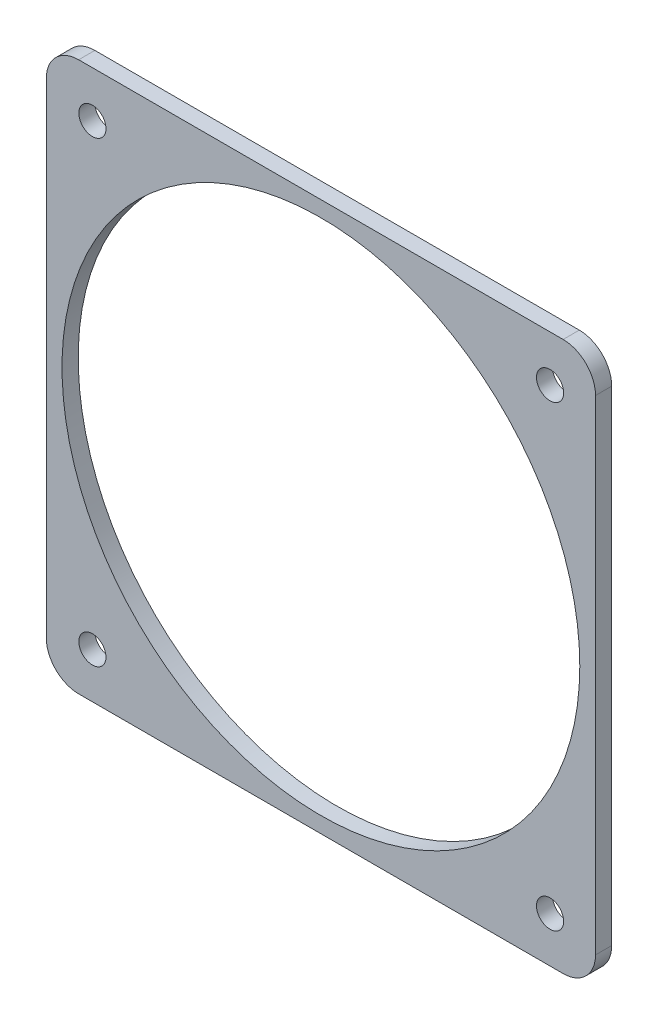
ISO-10303-21;
HEADER;
FILE_DESCRIPTION(('STEP AP214'),'2;1');
FILE_NAME('part.step','',(''),(''),'','','');
FILE_SCHEMA(('AUTOMOTIVE_DESIGN { 1 0 10303 214 1 1 1 1 }'));
ENDSEC;
DATA;
#1=APPLICATION_CONTEXT('core data for automotive mechanical design processes');
#2=APPLICATION_PROTOCOL_DEFINITION('international standard','automotive_design',2000,#1);
#3=PRODUCT_CONTEXT('',#1,'mechanical');
#4=PRODUCT('Part','Part','',(#3));
#5=PRODUCT_RELATED_PRODUCT_CATEGORY('part','',(#4));
#6=PRODUCT_DEFINITION_FORMATION('','',#4);
#7=PRODUCT_DEFINITION_CONTEXT('part definition',#1,'design');
#8=PRODUCT_DEFINITION('design','',#6,#7);
#9=PRODUCT_DEFINITION_SHAPE('','',#8);
#10=(LENGTH_UNIT() NAMED_UNIT(*) SI_UNIT(.MILLI.,.METRE.));
#11=(NAMED_UNIT(*) PLANE_ANGLE_UNIT() SI_UNIT($,.RADIAN.));
#12=(NAMED_UNIT(*) SI_UNIT($,.STERADIAN.) SOLID_ANGLE_UNIT());
#13=UNCERTAINTY_MEASURE_WITH_UNIT(LENGTH_MEASURE(1.E-05),#10,'distance_accuracy_value','');
#14=(GEOMETRIC_REPRESENTATION_CONTEXT(3) GLOBAL_UNCERTAINTY_ASSIGNED_CONTEXT((#13)) GLOBAL_UNIT_ASSIGNED_CONTEXT((#10,
#11,#12)) REPRESENTATION_CONTEXT('',''));
#15=CARTESIAN_POINT('',(0.,0.,0.));
#16=DIRECTION('',(0.,0.,1.));
#17=DIRECTION('',(1.,0.,0.));
#18=AXIS2_PLACEMENT_3D('',#15,#16,#17);
#19=CARTESIAN_POINT('',(-53.8815367264149,-53.8815367264149,3.175));
#20=DIRECTION('',(0.,1.,0.));
#21=DIRECTION('',(0.,0.,1.));
#22=AXIS2_PLACEMENT_3D('',#19,#20,#21);
#23=PLANE('',#22);
#24=DIRECTION('',(1.,0.,0.));
#25=VECTOR('',#24,1.);
#26=CARTESIAN_POINT('',(-53.8815367264149,-53.8815367264149,3.175));
#27=LINE('',#26,#25);
#28=CARTESIAN_POINT('',(-47.5315367264149,-53.8815367264149,3.175));
#29=VERTEX_POINT('',#28);
#30=CARTESIAN_POINT('',(47.5315367264149,-53.8815367264149,3.175));
#31=VERTEX_POINT('',#30);
#32=EDGE_CURVE('E174',#29,#31,#27,.T.);
#33=ORIENTED_EDGE('',*,*,#32,.F.);
#34=DIRECTION('',(0.,0.,-1.));
#35=VECTOR('',#34,1.);
#36=CARTESIAN_POINT('',(-47.5315367264149,-53.8815367264149,0.));
#37=LINE('',#36,#35);
#38=CARTESIAN_POINT('',(-47.5315367264149,-53.8815367264149,0.));
#39=VERTEX_POINT('',#38);
#40=EDGE_CURVE('E11',#29,#39,#37,.T.);
#41=ORIENTED_EDGE('',*,*,#40,.T.);
#42=DIRECTION('',(1.,0.,0.));
#43=VECTOR('',#42,1.);
#44=CARTESIAN_POINT('',(-53.8815367264149,-53.8815367264149,0.));
#45=LINE('',#44,#43);
#46=CARTESIAN_POINT('',(47.5315367264149,-53.8815367264149,0.));
#47=VERTEX_POINT('',#46);
#48=EDGE_CURVE('E177',#39,#47,#45,.T.);
#49=ORIENTED_EDGE('',*,*,#48,.T.);
#50=DIRECTION('',(0.,0.,-1.));
#51=VECTOR('',#50,1.);
#52=CARTESIAN_POINT('',(47.5315367264149,-53.8815367264149,3.175));
#53=LINE('',#52,#51);
#54=EDGE_CURVE('E50',#47,#31,#53,.F.);
#55=ORIENTED_EDGE('',*,*,#54,.T.);
#56=EDGE_LOOP('',(#33,#41,#49,#55));
#57=FACE_BOUND('',#56,.T.);
#58=ADVANCED_FACE('F41',(#57),#23,.F.);
#59=CARTESIAN_POINT('',(53.8815367264149,-53.8815367264149,3.175));
#60=DIRECTION('',(-1.,0.,0.));
#61=DIRECTION('',(0.,0.,1.));
#62=AXIS2_PLACEMENT_3D('',#59,#60,#61);
#63=PLANE('',#62);
#64=DIRECTION('',(0.,1.,0.));
#65=VECTOR('',#64,1.);
#66=CARTESIAN_POINT('',(53.8815367264149,-53.8815367264149,0.));
#67=LINE('',#66,#65);
#68=CARTESIAN_POINT('',(53.8815367264149,-47.5315367264149,0.));
#69=VERTEX_POINT('',#68);
#70=CARTESIAN_POINT('',(53.8815367264149,47.5315367264149,0.));
#71=VERTEX_POINT('',#70);
#72=EDGE_CURVE('E134',#69,#71,#67,.T.);
#73=ORIENTED_EDGE('',*,*,#72,.T.);
#74=DIRECTION('',(0.,0.,-1.));
#75=VECTOR('',#74,1.);
#76=CARTESIAN_POINT('',(53.8815367264149,47.5315367264149,3.175));
#77=LINE('',#76,#75);
#78=CARTESIAN_POINT('',(53.8815367264149,47.5315367264149,3.175));
#79=VERTEX_POINT('',#78);
#80=EDGE_CURVE('E154',#71,#79,#77,.F.);
#81=ORIENTED_EDGE('',*,*,#80,.T.);
#82=DIRECTION('',(0.,1.,0.));
#83=VECTOR('',#82,1.);
#84=CARTESIAN_POINT('',(53.8815367264149,-53.8815367264149,3.175));
#85=LINE('',#84,#83);
#86=CARTESIAN_POINT('',(53.8815367264149,-47.5315367264149,3.175));
#87=VERTEX_POINT('',#86);
#88=EDGE_CURVE('E185',#87,#79,#85,.T.);
#89=ORIENTED_EDGE('',*,*,#88,.F.);
#90=DIRECTION('',(0.,0.,-1.));
#91=VECTOR('',#90,1.);
#92=CARTESIAN_POINT('',(53.8815367264149,-47.5315367264149,3.175));
#93=LINE('',#92,#91);
#94=EDGE_CURVE('E151',#87,#69,#93,.T.);
#95=ORIENTED_EDGE('',*,*,#94,.T.);
#96=EDGE_LOOP('',(#73,#81,#89,#95));
#97=FACE_BOUND('',#96,.T.);
#98=ADVANCED_FACE('F191',(#97),#63,.F.);
#99=CARTESIAN_POINT('',(-53.8815367264149,53.8815367264149,3.175));
#100=DIRECTION('',(0.,1.,0.));
#101=DIRECTION('',(0.,0.,1.));
#102=AXIS2_PLACEMENT_3D('',#99,#100,#101);
#103=PLANE('',#102);
#104=DIRECTION('',(1.,0.,0.));
#105=VECTOR('',#104,1.);
#106=CARTESIAN_POINT('',(-53.8815367264149,53.8815367264149,3.175));
#107=LINE('',#106,#105);
#108=CARTESIAN_POINT('',(-47.5315367264149,53.8815367264149,3.175));
#109=VERTEX_POINT('',#108);
#110=CARTESIAN_POINT('',(47.5315367264149,53.8815367264149,3.175));
#111=VERTEX_POINT('',#110);
#112=EDGE_CURVE('E142',#109,#111,#107,.T.);
#113=ORIENTED_EDGE('',*,*,#112,.T.);
#114=DIRECTION('',(0.,0.,-1.));
#115=VECTOR('',#114,1.);
#116=CARTESIAN_POINT('',(47.5315367264149,53.8815367264149,0.));
#117=LINE('',#116,#115);
#118=CARTESIAN_POINT('',(47.5315367264149,53.8815367264149,0.));
#119=VERTEX_POINT('',#118);
#120=EDGE_CURVE('E133',#111,#119,#117,.T.);
#121=ORIENTED_EDGE('',*,*,#120,.T.);
#122=DIRECTION('',(1.,0.,0.));
#123=VECTOR('',#122,1.);
#124=CARTESIAN_POINT('',(-53.8815367264149,53.8815367264149,0.));
#125=LINE('',#124,#123);
#126=CARTESIAN_POINT('',(-47.5315367264149,53.8815367264149,0.));
#127=VERTEX_POINT('',#126);
#128=EDGE_CURVE('E118',#127,#119,#125,.T.);
#129=ORIENTED_EDGE('',*,*,#128,.F.);
#130=DIRECTION('',(0.,0.,-1.));
#131=VECTOR('',#130,1.);
#132=CARTESIAN_POINT('',(-47.5315367264149,53.8815367264149,3.175));
#133=LINE('',#132,#131);
#134=EDGE_CURVE('E131',#127,#109,#133,.F.);
#135=ORIENTED_EDGE('',*,*,#134,.T.);
#136=EDGE_LOOP('',(#113,#121,#129,#135));
#137=FACE_BOUND('',#136,.T.);
#138=ADVANCED_FACE('F130',(#137),#103,.T.);
#139=CARTESIAN_POINT('',(-53.8815367264149,-53.8815367264149,3.175));
#140=DIRECTION('',(-1.,0.,0.));
#141=DIRECTION('',(0.,0.,1.));
#142=AXIS2_PLACEMENT_3D('',#139,#140,#141);
#143=PLANE('',#142);
#144=DIRECTION('',(0.,1.,0.));
#145=VECTOR('',#144,1.);
#146=CARTESIAN_POINT('',(-53.8815367264149,-53.8815367264149,3.175));
#147=LINE('',#146,#145);
#148=CARTESIAN_POINT('',(-53.8815367264149,-47.5315367264149,3.175));
#149=VERTEX_POINT('',#148);
#150=CARTESIAN_POINT('',(-53.8815367264149,47.5315367264149,3.175));
#151=VERTEX_POINT('',#150);
#152=EDGE_CURVE('E137',#149,#151,#147,.T.);
#153=ORIENTED_EDGE('',*,*,#152,.T.);
#154=DIRECTION('',(0.,0.,-1.));
#155=VECTOR('',#154,1.);
#156=CARTESIAN_POINT('',(-53.8815367264149,47.5315367264149,3.175));
#157=LINE('',#156,#155);
#158=CARTESIAN_POINT('',(-53.8815367264149,47.5315367264149,0.));
#159=VERTEX_POINT('',#158);
#160=EDGE_CURVE('E167',#151,#159,#157,.T.);
#161=ORIENTED_EDGE('',*,*,#160,.T.);
#162=DIRECTION('',(0.,1.,0.));
#163=VECTOR('',#162,1.);
#164=CARTESIAN_POINT('',(-53.8815367264149,-53.8815367264149,0.));
#165=LINE('',#164,#163);
#166=CARTESIAN_POINT('',(-53.8815367264149,-47.5315367264149,0.));
#167=VERTEX_POINT('',#166);
#168=EDGE_CURVE('E119',#167,#159,#165,.T.);
#169=ORIENTED_EDGE('',*,*,#168,.F.);
#170=DIRECTION('',(0.,0.,-1.));
#171=VECTOR('',#170,1.);
#172=CARTESIAN_POINT('',(-53.8815367264149,-47.5315367264149,3.175));
#173=LINE('',#172,#171);
#174=EDGE_CURVE('E66',#167,#149,#173,.F.);
#175=ORIENTED_EDGE('',*,*,#174,.T.);
#176=EDGE_LOOP('',(#153,#161,#169,#175));
#177=FACE_BOUND('',#176,.T.);
#178=ADVANCED_FACE('F243',(#177),#143,.T.);
#179=CARTESIAN_POINT('',(0.,0.,3.175));
#180=DIRECTION('',(0.,0.,1.));
#181=DIRECTION('',(1.,0.,0.));
#182=AXIS2_PLACEMENT_3D('',#179,#180,#181);
#183=PLANE('',#182);
#184=CARTESIAN_POINT('',(44.9638153933632,44.8387458173236,3.175));
#185=DIRECTION('',(0.,0.,1.));
#186=DIRECTION('',(1.,0.,0.));
#187=AXIS2_PLACEMENT_3D('',#184,#185,#186);
#188=CIRCLE('',#187,2.66500000399999);
#189=CARTESIAN_POINT('',(47.6288153973632,44.8387458173236,3.175));
#190=VERTEX_POINT('',#189);
#191=EDGE_CURVE('E220',#190,#190,#188,.T.);
#192=ORIENTED_EDGE('',*,*,#191,.F.);
#193=EDGE_LOOP('',(#192));
#194=FACE_BOUND('',#193,.T.);
#195=CARTESIAN_POINT('',(-44.838745817327,-44.9638153933693,3.175));
#196=DIRECTION('',(0.,0.,1.));
#197=DIRECTION('',(1.,0.,0.));
#198=AXIS2_PLACEMENT_3D('',#195,#196,#197);
#199=CIRCLE('',#198,2.66500000399999);
#200=CARTESIAN_POINT('',(-42.173745813327,-44.9638153933693,3.175));
#201=VERTEX_POINT('',#200);
#202=EDGE_CURVE('E221',#201,#201,#199,.T.);
#203=ORIENTED_EDGE('',*,*,#202,.F.);
#204=EDGE_LOOP('',(#203));
#205=FACE_BOUND('',#204,.T.);
#206=CARTESIAN_POINT('',(44.9638153933647,-44.9638153933674,3.175));
#207=DIRECTION('',(0.,0.,1.));
#208=DIRECTION('',(1.,0.,0.));
#209=AXIS2_PLACEMENT_3D('',#206,#207,#208);
#210=CIRCLE('',#209,2.665000004);
#211=CARTESIAN_POINT('',(47.6288153973647,-44.9638153933674,3.175));
#212=VERTEX_POINT('',#211);
#213=EDGE_CURVE('E233',#212,#212,#210,.T.);
#214=ORIENTED_EDGE('',*,*,#213,.F.);
#215=EDGE_LOOP('',(#214));
#216=FACE_BOUND('',#215,.T.);
#217=CARTESIAN_POINT('',(-44.8387458173285,44.8387458173224,3.175));
#218=DIRECTION('',(0.,0.,1.));
#219=DIRECTION('',(1.,0.,0.));
#220=AXIS2_PLACEMENT_3D('',#217,#218,#219);
#221=CIRCLE('',#220,2.66500000399999);
#222=CARTESIAN_POINT('',(-42.1737458133286,44.8387458173224,3.175));
#223=VERTEX_POINT('',#222);
#224=EDGE_CURVE('E212',#223,#223,#221,.T.);
#225=ORIENTED_EDGE('',*,*,#224,.F.);
#226=EDGE_LOOP('',(#225));
#227=FACE_BOUND('',#226,.T.);
#228=CARTESIAN_POINT('',(0.,0.,3.175));
#229=DIRECTION('',(0.,0.,1.));
#230=DIRECTION('',(1.,0.,0.));
#231=AXIS2_PLACEMENT_3D('',#228,#229,#230);
#232=CIRCLE('',#231,50.8);
#233=CARTESIAN_POINT('',(50.8,0.,3.175));
#234=VERTEX_POINT('',#233);
#235=EDGE_CURVE('E205',#234,#234,#232,.T.);
#236=ORIENTED_EDGE('',*,*,#235,.F.);
#237=EDGE_LOOP('',(#236));
#238=FACE_BOUND('',#237,.T.);
#239=ORIENTED_EDGE('',*,*,#88,.T.);
#240=CARTESIAN_POINT('',(47.5315367264149,47.5315367264149,3.175));
#241=DIRECTION('',(0.,0.,1.));
#242=DIRECTION('',(1.,0.,0.));
#243=AXIS2_PLACEMENT_3D('',#240,#241,#242);
#244=CIRCLE('',#243,6.35);
#245=EDGE_CURVE('E163',#79,#111,#244,.T.);
#246=ORIENTED_EDGE('',*,*,#245,.T.);
#247=ORIENTED_EDGE('',*,*,#112,.F.);
#248=CARTESIAN_POINT('',(-47.5315367264149,47.5315367264149,3.175));
#249=DIRECTION('',(0.,0.,1.));
#250=DIRECTION('',(1.,0.,0.));
#251=AXIS2_PLACEMENT_3D('',#248,#249,#250);
#252=CIRCLE('',#251,6.35);
#253=EDGE_CURVE('E57',#109,#151,#252,.T.);
#254=ORIENTED_EDGE('',*,*,#253,.T.);
#255=ORIENTED_EDGE('',*,*,#152,.F.);
#256=CARTESIAN_POINT('',(-47.5315367264149,-47.5315367264149,3.175));
#257=DIRECTION('',(0.,0.,1.));
#258=DIRECTION('',(1.,0.,0.));
#259=AXIS2_PLACEMENT_3D('',#256,#257,#258);
#260=CIRCLE('',#259,6.35);
#261=EDGE_CURVE('E159',#149,#29,#260,.T.);
#262=ORIENTED_EDGE('',*,*,#261,.T.);
#263=ORIENTED_EDGE('',*,*,#32,.T.);
#264=CARTESIAN_POINT('',(47.5315367264149,-47.5315367264149,3.175));
#265=DIRECTION('',(0.,0.,1.));
#266=DIRECTION('',(1.,0.,0.));
#267=AXIS2_PLACEMENT_3D('',#264,#265,#266);
#268=CIRCLE('',#267,6.35);
#269=EDGE_CURVE('E156',#31,#87,#268,.T.);
#270=ORIENTED_EDGE('',*,*,#269,.T.);
#271=EDGE_LOOP('',(#239,#246,#247,#254,#255,#262,#263,#270));
#272=FACE_BOUND('',#271,.T.);
#273=ADVANCED_FACE('F181',(#194,#205,#216,#227,#238,#272),#183,.T.);
#274=CARTESIAN_POINT('',(0.,0.,0.));
#275=DIRECTION('',(0.,0.,1.));
#276=DIRECTION('',(1.,0.,0.));
#277=AXIS2_PLACEMENT_3D('',#274,#275,#276);
#278=PLANE('',#277);
#279=CARTESIAN_POINT('',(44.9638153933632,44.8387458173236,0.));
#280=DIRECTION('',(0.,0.,1.));
#281=DIRECTION('',(1.,0.,0.));
#282=AXIS2_PLACEMENT_3D('',#279,#280,#281);
#283=CIRCLE('',#282,2.66500000399999);
#284=CARTESIAN_POINT('',(47.6288153973632,44.8387458173236,0.));
#285=VERTEX_POINT('',#284);
#286=EDGE_CURVE('E215',#285,#285,#283,.F.);
#287=ORIENTED_EDGE('',*,*,#286,.F.);
#288=EDGE_LOOP('',(#287));
#289=FACE_BOUND('',#288,.T.);
#290=CARTESIAN_POINT('',(-44.838745817327,-44.9638153933693,0.));
#291=DIRECTION('',(0.,0.,1.));
#292=DIRECTION('',(1.,0.,0.));
#293=AXIS2_PLACEMENT_3D('',#290,#291,#292);
#294=CIRCLE('',#293,2.66500000399999);
#295=CARTESIAN_POINT('',(-42.173745813327,-44.9638153933693,0.));
#296=VERTEX_POINT('',#295);
#297=EDGE_CURVE('E216',#296,#296,#294,.F.);
#298=ORIENTED_EDGE('',*,*,#297,.F.);
#299=EDGE_LOOP('',(#298));
#300=FACE_BOUND('',#299,.T.);
#301=CARTESIAN_POINT('',(44.9638153933647,-44.9638153933674,0.));
#302=DIRECTION('',(0.,0.,1.));
#303=DIRECTION('',(1.,0.,0.));
#304=AXIS2_PLACEMENT_3D('',#301,#302,#303);
#305=CIRCLE('',#304,2.665000004);
#306=CARTESIAN_POINT('',(47.6288153973647,-44.9638153933674,0.));
#307=VERTEX_POINT('',#306);
#308=EDGE_CURVE('E225',#307,#307,#305,.F.);
#309=ORIENTED_EDGE('',*,*,#308,.F.);
#310=EDGE_LOOP('',(#309));
#311=FACE_BOUND('',#310,.T.);
#312=CARTESIAN_POINT('',(-44.8387458173285,44.8387458173224,0.));
#313=DIRECTION('',(0.,0.,1.));
#314=DIRECTION('',(1.,0.,0.));
#315=AXIS2_PLACEMENT_3D('',#312,#313,#314);
#316=CIRCLE('',#315,2.66500000399999);
#317=CARTESIAN_POINT('',(-42.1737458133286,44.8387458173224,0.));
#318=VERTEX_POINT('',#317);
#319=EDGE_CURVE('E209',#318,#318,#316,.F.);
#320=ORIENTED_EDGE('',*,*,#319,.F.);
#321=EDGE_LOOP('',(#320));
#322=FACE_BOUND('',#321,.T.);
#323=CARTESIAN_POINT('',(0.,0.,0.));
#324=DIRECTION('',(0.,0.,1.));
#325=DIRECTION('',(1.,0.,0.));
#326=AXIS2_PLACEMENT_3D('',#323,#324,#325);
#327=CIRCLE('',#326,50.8);
#328=CARTESIAN_POINT('',(50.8,0.,0.));
#329=VERTEX_POINT('',#328);
#330=EDGE_CURVE('E197',#329,#329,#327,.F.);
#331=ORIENTED_EDGE('',*,*,#330,.F.);
#332=EDGE_LOOP('',(#331));
#333=FACE_BOUND('',#332,.T.);
#334=ORIENTED_EDGE('',*,*,#128,.T.);
#335=CARTESIAN_POINT('',(47.5315367264149,47.5315367264149,0.));
#336=DIRECTION('',(0.,0.,1.));
#337=DIRECTION('',(1.,0.,0.));
#338=AXIS2_PLACEMENT_3D('',#335,#336,#337);
#339=CIRCLE('',#338,6.35);
#340=EDGE_CURVE('E124',#119,#71,#339,.F.);
#341=ORIENTED_EDGE('',*,*,#340,.T.);
#342=ORIENTED_EDGE('',*,*,#72,.F.);
#343=CARTESIAN_POINT('',(47.5315367264149,-47.5315367264149,0.));
#344=DIRECTION('',(0.,0.,1.));
#345=DIRECTION('',(1.,0.,0.));
#346=AXIS2_PLACEMENT_3D('',#343,#344,#345);
#347=CIRCLE('',#346,6.35);
#348=EDGE_CURVE('E139',#69,#47,#347,.F.);
#349=ORIENTED_EDGE('',*,*,#348,.T.);
#350=ORIENTED_EDGE('',*,*,#48,.F.);
#351=CARTESIAN_POINT('',(-47.5315367264149,-47.5315367264149,0.));
#352=DIRECTION('',(0.,0.,1.));
#353=DIRECTION('',(1.,0.,0.));
#354=AXIS2_PLACEMENT_3D('',#351,#352,#353);
#355=CIRCLE('',#354,6.35);
#356=EDGE_CURVE('E125',#39,#167,#355,.F.);
#357=ORIENTED_EDGE('',*,*,#356,.T.);
#358=ORIENTED_EDGE('',*,*,#168,.T.);
#359=CARTESIAN_POINT('',(-47.5315367264149,47.5315367264149,0.));
#360=DIRECTION('',(0.,0.,1.));
#361=DIRECTION('',(1.,0.,0.));
#362=AXIS2_PLACEMENT_3D('',#359,#360,#361);
#363=CIRCLE('',#362,6.35);
#364=EDGE_CURVE('E115',#159,#127,#363,.F.);
#365=ORIENTED_EDGE('',*,*,#364,.T.);
#366=EDGE_LOOP('',(#334,#341,#342,#349,#350,#357,#358,#365));
#367=FACE_BOUND('',#366,.T.);
#368=ADVANCED_FACE('F117',(#289,#300,#311,#322,#333,#367),#278,.F.);
#369=CARTESIAN_POINT('',(0.,0.,-0.00100000000000013));
#370=DIRECTION('',(0.,0.,1.));
#371=DIRECTION('',(1.,0.,0.));
#372=AXIS2_PLACEMENT_3D('',#369,#370,#371);
#373=CYLINDRICAL_SURFACE('',#372,50.8);
#374=ORIENTED_EDGE('',*,*,#235,.T.);
#375=EDGE_LOOP('',(#374));
#376=FACE_BOUND('',#375,.T.);
#377=ORIENTED_EDGE('',*,*,#330,.T.);
#378=EDGE_LOOP('',(#377));
#379=FACE_BOUND('',#378,.T.);
#380=ADVANCED_FACE('F250',(#376,#379),#373,.F.);
#381=CARTESIAN_POINT('',(47.5315367264149,47.5315367264149,3.175));
#382=DIRECTION('',(0.,0.,1.));
#383=DIRECTION('',(1.,0.,0.));
#384=AXIS2_PLACEMENT_3D('',#381,#382,#383);
#385=CYLINDRICAL_SURFACE('',#384,6.35);
#386=ORIENTED_EDGE('',*,*,#245,.F.);
#387=ORIENTED_EDGE('',*,*,#80,.F.);
#388=ORIENTED_EDGE('',*,*,#340,.F.);
#389=ORIENTED_EDGE('',*,*,#120,.F.);
#390=EDGE_LOOP('',(#386,#387,#388,#389));
#391=FACE_BOUND('',#390,.T.);
#392=ADVANCED_FACE('F253',(#391),#385,.T.);
#393=CARTESIAN_POINT('',(-47.5315367264149,47.5315367264149,3.175));
#394=DIRECTION('',(0.,0.,-1.));
#395=DIRECTION('',(-1.,0.,0.));
#396=AXIS2_PLACEMENT_3D('',#393,#394,#395);
#397=CYLINDRICAL_SURFACE('',#396,6.35);
#398=ORIENTED_EDGE('',*,*,#253,.F.);
#399=ORIENTED_EDGE('',*,*,#134,.F.);
#400=ORIENTED_EDGE('',*,*,#364,.F.);
#401=ORIENTED_EDGE('',*,*,#160,.F.);
#402=EDGE_LOOP('',(#398,#399,#400,#401));
#403=FACE_BOUND('',#402,.T.);
#404=ADVANCED_FACE('F136',(#403),#397,.T.);
#405=CARTESIAN_POINT('',(-47.5315367264149,-47.5315367264149,3.175));
#406=DIRECTION('',(0.,0.,1.));
#407=DIRECTION('',(1.,0.,0.));
#408=AXIS2_PLACEMENT_3D('',#405,#406,#407);
#409=CYLINDRICAL_SURFACE('',#408,6.35);
#410=ORIENTED_EDGE('',*,*,#261,.F.);
#411=ORIENTED_EDGE('',*,*,#174,.F.);
#412=ORIENTED_EDGE('',*,*,#356,.F.);
#413=ORIENTED_EDGE('',*,*,#40,.F.);
#414=EDGE_LOOP('',(#410,#411,#412,#413));
#415=FACE_BOUND('',#414,.T.);
#416=ADVANCED_FACE('F277',(#415),#409,.T.);
#417=CARTESIAN_POINT('',(47.5315367264149,-47.5315367264149,3.175));
#418=DIRECTION('',(0.,0.,-1.));
#419=DIRECTION('',(-1.,0.,0.));
#420=AXIS2_PLACEMENT_3D('',#417,#418,#419);
#421=CYLINDRICAL_SURFACE('',#420,6.35);
#422=ORIENTED_EDGE('',*,*,#269,.F.);
#423=ORIENTED_EDGE('',*,*,#54,.F.);
#424=ORIENTED_EDGE('',*,*,#348,.F.);
#425=ORIENTED_EDGE('',*,*,#94,.F.);
#426=EDGE_LOOP('',(#422,#423,#424,#425));
#427=FACE_BOUND('',#426,.T.);
#428=ADVANCED_FACE('F43',(#427),#421,.T.);
#429=CARTESIAN_POINT('',(-44.8387458173285,44.8387458173224,-0.00100000000000013));
#430=DIRECTION('',(0.,0.,1.));
#431=DIRECTION('',(1.,0.,0.));
#432=AXIS2_PLACEMENT_3D('',#429,#430,#431);
#433=CYLINDRICAL_SURFACE('',#432,2.66500000399999);
#434=ORIENTED_EDGE('',*,*,#224,.T.);
#435=EDGE_LOOP('',(#434));
#436=FACE_BOUND('',#435,.T.);
#437=ORIENTED_EDGE('',*,*,#319,.T.);
#438=EDGE_LOOP('',(#437));
#439=FACE_BOUND('',#438,.T.);
#440=ADVANCED_FACE('F283',(#436,#439),#433,.F.);
#441=CARTESIAN_POINT('',(44.9638153933647,-44.9638153933674,-0.00100000000000013));
#442=DIRECTION('',(0.,0.,1.));
#443=DIRECTION('',(1.,0.,0.));
#444=AXIS2_PLACEMENT_3D('',#441,#442,#443);
#445=CYLINDRICAL_SURFACE('',#444,2.665000004);
#446=ORIENTED_EDGE('',*,*,#213,.T.);
#447=EDGE_LOOP('',(#446));
#448=FACE_BOUND('',#447,.T.);
#449=ORIENTED_EDGE('',*,*,#308,.T.);
#450=EDGE_LOOP('',(#449));
#451=FACE_BOUND('',#450,.T.);
#452=ADVANCED_FACE('F238',(#448,#451),#445,.F.);
#453=CARTESIAN_POINT('',(-44.838745817327,-44.9638153933693,-0.00100000000000013));
#454=DIRECTION('',(0.,0.,1.));
#455=DIRECTION('',(1.,0.,0.));
#456=AXIS2_PLACEMENT_3D('',#453,#454,#455);
#457=CYLINDRICAL_SURFACE('',#456,2.66500000399999);
#458=ORIENTED_EDGE('',*,*,#202,.T.);
#459=EDGE_LOOP('',(#458));
#460=FACE_BOUND('',#459,.T.);
#461=ORIENTED_EDGE('',*,*,#297,.T.);
#462=EDGE_LOOP('',(#461));
#463=FACE_BOUND('',#462,.T.);
#464=ADVANCED_FACE('F357',(#460,#463),#457,.F.);
#465=CARTESIAN_POINT('',(44.9638153933632,44.8387458173236,-0.00100000000000013));
#466=DIRECTION('',(0.,0.,1.));
#467=DIRECTION('',(1.,0.,0.));
#468=AXIS2_PLACEMENT_3D('',#465,#466,#467);
#469=CYLINDRICAL_SURFACE('',#468,2.66500000399999);
#470=ORIENTED_EDGE('',*,*,#191,.T.);
#471=EDGE_LOOP('',(#470));
#472=FACE_BOUND('',#471,.T.);
#473=ORIENTED_EDGE('',*,*,#286,.T.);
#474=EDGE_LOOP('',(#473));
#475=FACE_BOUND('',#474,.T.);
#476=ADVANCED_FACE('F365',(#472,#475),#469,.F.);
#477=CLOSED_SHELL('',(#58,#98,#138,#178,#273,#368,#380,#392,#404,#416,#428,#440,#452,#464,#476));
#478=MANIFOLD_SOLID_BREP('B2',#477);
#479=ADVANCED_BREP_SHAPE_REPRESENTATION('',(#18,#478),#14);
#480=SHAPE_DEFINITION_REPRESENTATION(#9,#479);
ENDSEC;
END-ISO-10303-21;
